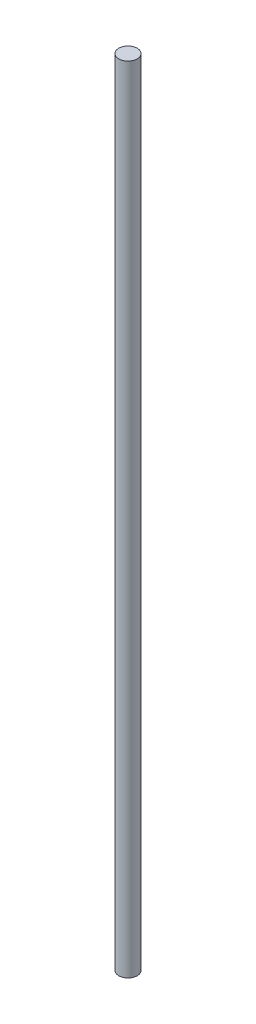
ISO-10303-21;
HEADER;
FILE_DESCRIPTION(('STEP AP214'),'2;1');
FILE_NAME('part.step','',(''),(''),'','','');
FILE_SCHEMA(('AUTOMOTIVE_DESIGN { 1 0 10303 214 1 1 1 1 }'));
ENDSEC;
DATA;
#1=APPLICATION_CONTEXT('core data for automotive mechanical design processes');
#2=APPLICATION_PROTOCOL_DEFINITION('international standard','automotive_design',2000,#1);
#3=PRODUCT_CONTEXT('',#1,'mechanical');
#4=PRODUCT('Part','Part','',(#3));
#5=PRODUCT_RELATED_PRODUCT_CATEGORY('part','',(#4));
#6=PRODUCT_DEFINITION_FORMATION('','',#4);
#7=PRODUCT_DEFINITION_CONTEXT('part definition',#1,'design');
#8=PRODUCT_DEFINITION('design','',#6,#7);
#9=PRODUCT_DEFINITION_SHAPE('','',#8);
#10=(LENGTH_UNIT() NAMED_UNIT(*) SI_UNIT(.MILLI.,.METRE.));
#11=(NAMED_UNIT(*) PLANE_ANGLE_UNIT() SI_UNIT($,.RADIAN.));
#12=(NAMED_UNIT(*) SI_UNIT($,.STERADIAN.) SOLID_ANGLE_UNIT());
#13=UNCERTAINTY_MEASURE_WITH_UNIT(LENGTH_MEASURE(1.E-05),#10,'distance_accuracy_value','');
#14=(GEOMETRIC_REPRESENTATION_CONTEXT(3) GLOBAL_UNCERTAINTY_ASSIGNED_CONTEXT((#13)) GLOBAL_UNIT_ASSIGNED_CONTEXT((#10,
#11,#12)) REPRESENTATION_CONTEXT('',''));
#15=CARTESIAN_POINT('',(0.,0.,0.));
#16=DIRECTION('',(0.,0.,1.));
#17=DIRECTION('',(1.,0.,0.));
#18=AXIS2_PLACEMENT_3D('',#15,#16,#17);
#19=CARTESIAN_POINT('',(0.,344.,0.));
#20=DIRECTION('',(0.,-1.,0.));
#21=DIRECTION('',(0.,0.,-1.));
#22=AXIS2_PLACEMENT_3D('',#19,#20,#21);
#23=CYLINDRICAL_SURFACE('',#22,4.);
#24=CARTESIAN_POINT('',(0.,344.,0.));
#25=DIRECTION('',(0.,1.,0.));
#26=DIRECTION('',(0.,0.,1.));
#27=AXIS2_PLACEMENT_3D('',#24,#25,#26);
#28=CIRCLE('',#27,4.);
#29=CARTESIAN_POINT('',(0.,344.,4.));
#30=VERTEX_POINT('',#29);
#31=EDGE_CURVE('E10',#30,#30,#28,.T.);
#32=ORIENTED_EDGE('',*,*,#31,.F.);
#33=EDGE_LOOP('',(#32));
#34=FACE_BOUND('',#33,.T.);
#35=CARTESIAN_POINT('',(0.,0.,0.));
#36=DIRECTION('',(0.,1.,0.));
#37=DIRECTION('',(0.,0.,1.));
#38=AXIS2_PLACEMENT_3D('',#35,#36,#37);
#39=CIRCLE('',#38,4.);
#40=CARTESIAN_POINT('',(0.,0.,4.));
#41=VERTEX_POINT('',#40);
#42=EDGE_CURVE('E36',#41,#41,#39,.T.);
#43=ORIENTED_EDGE('',*,*,#42,.T.);
#44=EDGE_LOOP('',(#43));
#45=FACE_BOUND('',#44,.T.);
#46=ADVANCED_FACE('F33',(#34,#45),#23,.T.);
#47=CARTESIAN_POINT('',(0.,344.,0.));
#48=DIRECTION('',(0.,1.,0.));
#49=DIRECTION('',(0.,0.,1.));
#50=AXIS2_PLACEMENT_3D('',#47,#48,#49);
#51=PLANE('',#50);
#52=ORIENTED_EDGE('',*,*,#31,.T.);
#53=EDGE_LOOP('',(#52));
#54=FACE_BOUND('',#53,.T.);
#55=ADVANCED_FACE('F48',(#54),#51,.T.);
#56=CARTESIAN_POINT('',(0.,0.,0.));
#57=DIRECTION('',(0.,1.,0.));
#58=DIRECTION('',(0.,0.,1.));
#59=AXIS2_PLACEMENT_3D('',#56,#57,#58);
#60=PLANE('',#59);
#61=ORIENTED_EDGE('',*,*,#42,.F.);
#62=EDGE_LOOP('',(#61));
#63=FACE_BOUND('',#62,.T.);
#64=ADVANCED_FACE('F46',(#63),#60,.F.);
#65=CLOSED_SHELL('',(#46,#55,#64));
#66=MANIFOLD_SOLID_BREP('B2',#65);
#67=ADVANCED_BREP_SHAPE_REPRESENTATION('',(#18,#66),#14);
#68=SHAPE_DEFINITION_REPRESENTATION(#9,#67);
ENDSEC;
END-ISO-10303-21;
